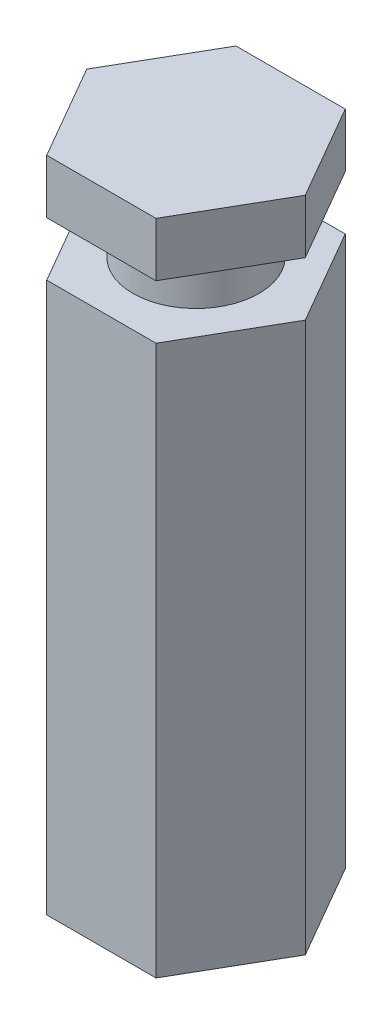
ISO-10303-21;
HEADER;
FILE_DESCRIPTION(('STEP AP214'),'2;1');
FILE_NAME('part.step','',(''),(''),'','','');
FILE_SCHEMA(('AUTOMOTIVE_DESIGN { 1 0 10303 214 1 1 1 1 }'));
ENDSEC;
DATA;
#1=APPLICATION_CONTEXT('core data for automotive mechanical design processes');
#2=APPLICATION_PROTOCOL_DEFINITION('international standard','automotive_design',2000,#1);
#3=PRODUCT_CONTEXT('',#1,'mechanical');
#4=PRODUCT('Part','Part','',(#3));
#5=PRODUCT_RELATED_PRODUCT_CATEGORY('part','',(#4));
#6=PRODUCT_DEFINITION_FORMATION('','',#4);
#7=PRODUCT_DEFINITION_CONTEXT('part definition',#1,'design');
#8=PRODUCT_DEFINITION('design','',#6,#7);
#9=PRODUCT_DEFINITION_SHAPE('','',#8);
#10=(LENGTH_UNIT() NAMED_UNIT(*) SI_UNIT(.MILLI.,.METRE.));
#11=(NAMED_UNIT(*) PLANE_ANGLE_UNIT() SI_UNIT($,.RADIAN.));
#12=(NAMED_UNIT(*) SI_UNIT($,.STERADIAN.) SOLID_ANGLE_UNIT());
#13=UNCERTAINTY_MEASURE_WITH_UNIT(LENGTH_MEASURE(1.E-05),#10,'distance_accuracy_value','');
#14=(GEOMETRIC_REPRESENTATION_CONTEXT(3) GLOBAL_UNCERTAINTY_ASSIGNED_CONTEXT((#13)) GLOBAL_UNIT_ASSIGNED_CONTEXT((#10,
#11,#12)) REPRESENTATION_CONTEXT('',''));
#15=CARTESIAN_POINT('',(0.,0.,0.));
#16=DIRECTION('',(0.,0.,1.));
#17=DIRECTION('',(1.,0.,0.));
#18=AXIS2_PLACEMENT_3D('',#15,#16,#17);
#19=CARTESIAN_POINT('',(-6.06217782649115,61.,-10.4999999999999));
#20=DIRECTION('',(0.866025403784441,0.,0.499999999999995));
#21=DIRECTION('',(0.499999999999995,0.,-0.866025403784442));
#22=AXIS2_PLACEMENT_3D('',#19,#20,#21);
#23=PLANE('',#22);
#24=DIRECTION('',(-0.499999999999995,0.,0.866025403784441));
#25=VECTOR('',#24,1.);
#26=CARTESIAN_POINT('',(-6.06217782649115,0.,-10.4999999999999));
#27=LINE('',#26,#25);
#28=CARTESIAN_POINT('',(-6.06217782649115,0.,-10.4999999999999));
#29=VERTEX_POINT('',#28);
#30=CARTESIAN_POINT('',(-12.1243556529821,0.,0.));
#31=VERTEX_POINT('',#30);
#32=EDGE_CURVE('E132',#29,#31,#27,.T.);
#33=ORIENTED_EDGE('',*,*,#32,.T.);
#34=DIRECTION('',(0.,-1.,0.));
#35=VECTOR('',#34,1.);
#36=CARTESIAN_POINT('',(-12.1243556529821,61.,0.));
#37=LINE('',#36,#35);
#38=CARTESIAN_POINT('',(-12.1243556529821,61.,0.));
#39=VERTEX_POINT('',#38);
#40=EDGE_CURVE('E42',#39,#31,#37,.T.);
#41=ORIENTED_EDGE('',*,*,#40,.F.);
#42=DIRECTION('',(-0.499999999999995,0.,0.866025403784441));
#43=VECTOR('',#42,1.);
#44=CARTESIAN_POINT('',(-6.06217782649115,61.,-10.4999999999999));
#45=LINE('',#44,#43);
#46=CARTESIAN_POINT('',(-6.06217782649115,61.,-10.4999999999999));
#47=VERTEX_POINT('',#46);
#48=EDGE_CURVE('E142',#47,#39,#45,.T.);
#49=ORIENTED_EDGE('',*,*,#48,.F.);
#50=DIRECTION('',(0.,-1.,0.));
#51=VECTOR('',#50,1.);
#52=CARTESIAN_POINT('',(-6.06217782649115,61.,-10.4999999999999));
#53=LINE('',#52,#51);
#54=EDGE_CURVE('E130',#47,#29,#53,.T.);
#55=ORIENTED_EDGE('',*,*,#54,.T.);
#56=EDGE_LOOP('',(#33,#41,#49,#55));
#57=FACE_BOUND('',#56,.T.);
#58=ADVANCED_FACE('F41',(#57),#23,.F.);
#59=CARTESIAN_POINT('',(-12.1243556529821,61.,0.));
#60=DIRECTION('',(0.866025403784438,0.,-0.500000000000001));
#61=DIRECTION('',(-0.500000000000001,0.,-0.866025403784438));
#62=AXIS2_PLACEMENT_3D('',#59,#60,#61);
#63=PLANE('',#62);
#64=DIRECTION('',(0.500000000000001,0.,0.866025403784438));
#65=VECTOR('',#64,1.);
#66=CARTESIAN_POINT('',(-12.1243556529821,0.,0.));
#67=LINE('',#66,#65);
#68=CARTESIAN_POINT('',(-6.06217782649101,0.,10.4999999999999));
#69=VERTEX_POINT('',#68);
#70=EDGE_CURVE('E131',#31,#69,#67,.T.);
#71=ORIENTED_EDGE('',*,*,#70,.T.);
#72=DIRECTION('',(0.,-1.,0.));
#73=VECTOR('',#72,1.);
#74=CARTESIAN_POINT('',(-6.06217782649101,61.,10.4999999999999));
#75=LINE('',#74,#73);
#76=CARTESIAN_POINT('',(-6.06217782649101,61.,10.4999999999999));
#77=VERTEX_POINT('',#76);
#78=EDGE_CURVE('E144',#77,#69,#75,.T.);
#79=ORIENTED_EDGE('',*,*,#78,.F.);
#80=DIRECTION('',(0.500000000000001,0.,0.866025403784438));
#81=VECTOR('',#80,1.);
#82=CARTESIAN_POINT('',(-12.1243556529821,61.,0.));
#83=LINE('',#82,#81);
#84=EDGE_CURVE('E100',#39,#77,#83,.T.);
#85=ORIENTED_EDGE('',*,*,#84,.F.);
#86=ORIENTED_EDGE('',*,*,#40,.T.);
#87=EDGE_LOOP('',(#71,#79,#85,#86));
#88=FACE_BOUND('',#87,.T.);
#89=ADVANCED_FACE('F147',(#88),#63,.F.);
#90=CARTESIAN_POINT('',(-6.06217782649101,61.,10.4999999999999));
#91=DIRECTION('',(0.,0.,-1.));
#92=DIRECTION('',(-1.,0.,0.));
#93=AXIS2_PLACEMENT_3D('',#90,#91,#92);
#94=PLANE('',#93);
#95=DIRECTION('',(1.,0.,0.));
#96=VECTOR('',#95,1.);
#97=CARTESIAN_POINT('',(-6.06217782649101,0.,10.4999999999999));
#98=LINE('',#97,#96);
#99=CARTESIAN_POINT('',(6.06217782649108,0.,10.4999999999999));
#100=VERTEX_POINT('',#99);
#101=EDGE_CURVE('E140',#69,#100,#98,.T.);
#102=ORIENTED_EDGE('',*,*,#101,.T.);
#103=DIRECTION('',(0.,-1.,0.));
#104=VECTOR('',#103,1.);
#105=CARTESIAN_POINT('',(6.06217782649108,61.,10.4999999999999));
#106=LINE('',#105,#104);
#107=CARTESIAN_POINT('',(6.06217782649108,61.,10.4999999999999));
#108=VERTEX_POINT('',#107);
#109=EDGE_CURVE('E125',#108,#100,#106,.T.);
#110=ORIENTED_EDGE('',*,*,#109,.F.);
#111=DIRECTION('',(1.,0.,0.));
#112=VECTOR('',#111,1.);
#113=CARTESIAN_POINT('',(-6.06217782649101,61.,10.4999999999999));
#114=LINE('',#113,#112);
#115=EDGE_CURVE('E114',#77,#108,#114,.T.);
#116=ORIENTED_EDGE('',*,*,#115,.F.);
#117=ORIENTED_EDGE('',*,*,#78,.T.);
#118=EDGE_LOOP('',(#102,#110,#116,#117));
#119=FACE_BOUND('',#118,.T.);
#120=ADVANCED_FACE('F156',(#119),#94,.F.);
#121=CARTESIAN_POINT('',(6.06217782649108,61.,10.4999999999999));
#122=DIRECTION('',(-0.866025403784441,0.,-0.499999999999995));
#123=DIRECTION('',(-0.499999999999995,0.,0.866025403784442));
#124=AXIS2_PLACEMENT_3D('',#121,#122,#123);
#125=PLANE('',#124);
#126=DIRECTION('',(0.499999999999995,0.,-0.866025403784442));
#127=VECTOR('',#126,1.);
#128=CARTESIAN_POINT('',(6.06217782649108,0.,10.4999999999999));
#129=LINE('',#128,#127);
#130=CARTESIAN_POINT('',(12.1243556529821,0.,0.));
#131=VERTEX_POINT('',#130);
#132=EDGE_CURVE('E122',#100,#131,#129,.T.);
#133=ORIENTED_EDGE('',*,*,#132,.T.);
#134=DIRECTION('',(0.,-1.,0.));
#135=VECTOR('',#134,1.);
#136=CARTESIAN_POINT('',(12.1243556529821,61.,0.));
#137=LINE('',#136,#135);
#138=CARTESIAN_POINT('',(12.1243556529821,61.,0.));
#139=VERTEX_POINT('',#138);
#140=EDGE_CURVE('E119',#139,#131,#137,.T.);
#141=ORIENTED_EDGE('',*,*,#140,.F.);
#142=DIRECTION('',(0.499999999999995,0.,-0.866025403784442));
#143=VECTOR('',#142,1.);
#144=CARTESIAN_POINT('',(6.06217782649108,61.,10.4999999999999));
#145=LINE('',#144,#143);
#146=EDGE_CURVE('E110',#108,#139,#145,.T.);
#147=ORIENTED_EDGE('',*,*,#146,.F.);
#148=ORIENTED_EDGE('',*,*,#109,.T.);
#149=EDGE_LOOP('',(#133,#141,#147,#148));
#150=FACE_BOUND('',#149,.T.);
#151=ADVANCED_FACE('F116',(#150),#125,.F.);
#152=CARTESIAN_POINT('',(12.1243556529821,61.,0.));
#153=DIRECTION('',(-0.866025403784434,0.,0.500000000000007));
#154=DIRECTION('',(0.500000000000007,0.,0.866025403784435));
#155=AXIS2_PLACEMENT_3D('',#152,#153,#154);
#156=PLANE('',#155);
#157=DIRECTION('',(-0.500000000000007,0.,-0.866025403784434));
#158=VECTOR('',#157,1.);
#159=CARTESIAN_POINT('',(12.1243556529821,0.,0.));
#160=LINE('',#159,#158);
#161=CARTESIAN_POINT('',(6.06217782649093,0.,-10.5));
#162=VERTEX_POINT('',#161);
#163=EDGE_CURVE('E85',#131,#162,#160,.T.);
#164=ORIENTED_EDGE('',*,*,#163,.T.);
#165=DIRECTION('',(0.,-1.,0.));
#166=VECTOR('',#165,1.);
#167=CARTESIAN_POINT('',(6.06217782649093,61.,-10.5));
#168=LINE('',#167,#166);
#169=CARTESIAN_POINT('',(6.06217782649093,61.,-10.5));
#170=VERTEX_POINT('',#169);
#171=EDGE_CURVE('E124',#170,#162,#168,.T.);
#172=ORIENTED_EDGE('',*,*,#171,.F.);
#173=DIRECTION('',(-0.500000000000007,0.,-0.866025403784434));
#174=VECTOR('',#173,1.);
#175=CARTESIAN_POINT('',(12.1243556529821,61.,0.));
#176=LINE('',#175,#174);
#177=EDGE_CURVE('E112',#139,#170,#176,.T.);
#178=ORIENTED_EDGE('',*,*,#177,.F.);
#179=ORIENTED_EDGE('',*,*,#140,.T.);
#180=EDGE_LOOP('',(#164,#172,#178,#179));
#181=FACE_BOUND('',#180,.T.);
#182=ADVANCED_FACE('F123',(#181),#156,.F.);
#183=CARTESIAN_POINT('',(6.06217782649093,61.,-10.5));
#184=DIRECTION('',(0.,0.,1.));
#185=DIRECTION('',(1.,0.,0.));
#186=AXIS2_PLACEMENT_3D('',#183,#184,#185);
#187=PLANE('',#186);
#188=DIRECTION('',(-1.,0.,0.));
#189=VECTOR('',#188,1.);
#190=CARTESIAN_POINT('',(6.06217782649093,0.,-10.5));
#191=LINE('',#190,#189);
#192=EDGE_CURVE('E86',#162,#29,#191,.T.);
#193=ORIENTED_EDGE('',*,*,#192,.T.);
#194=ORIENTED_EDGE('',*,*,#54,.F.);
#195=DIRECTION('',(-1.,0.,0.));
#196=VECTOR('',#195,1.);
#197=CARTESIAN_POINT('',(6.06217782649093,61.,-10.5));
#198=LINE('',#197,#196);
#199=EDGE_CURVE('E59',#170,#47,#198,.T.);
#200=ORIENTED_EDGE('',*,*,#199,.F.);
#201=ORIENTED_EDGE('',*,*,#171,.T.);
#202=EDGE_LOOP('',(#193,#194,#200,#201));
#203=FACE_BOUND('',#202,.T.);
#204=ADVANCED_FACE('F272',(#203),#187,.F.);
#205=CARTESIAN_POINT('',(0.,61.,0.));
#206=DIRECTION('',(0.,1.,0.));
#207=DIRECTION('',(0.,0.,1.));
#208=AXIS2_PLACEMENT_3D('',#205,#206,#207);
#209=PLANE('',#208);
#210=CARTESIAN_POINT('',(0.,61.,0.));
#211=DIRECTION('',(0.,1.,0.));
#212=DIRECTION('',(0.,0.,1.));
#213=AXIS2_PLACEMENT_3D('',#210,#211,#212);
#214=CIRCLE('',#213,7.);
#215=CARTESIAN_POINT('',(0.,61.,7.));
#216=VERTEX_POINT('',#215);
#217=EDGE_CURVE('E11',#216,#216,#214,.T.);
#218=ORIENTED_EDGE('',*,*,#217,.F.);
#219=EDGE_LOOP('',(#218));
#220=FACE_BOUND('',#219,.T.);
#221=ORIENTED_EDGE('',*,*,#48,.T.);
#222=ORIENTED_EDGE('',*,*,#84,.T.);
#223=ORIENTED_EDGE('',*,*,#115,.T.);
#224=ORIENTED_EDGE('',*,*,#146,.T.);
#225=ORIENTED_EDGE('',*,*,#177,.T.);
#226=ORIENTED_EDGE('',*,*,#199,.T.);
#227=EDGE_LOOP('',(#221,#222,#223,#224,#225,#226));
#228=FACE_BOUND('',#227,.T.);
#229=ADVANCED_FACE('F108',(#220,#228),#209,.T.);
#230=CARTESIAN_POINT('',(0.,0.,0.));
#231=DIRECTION('',(0.,1.,0.));
#232=DIRECTION('',(0.,0.,1.));
#233=AXIS2_PLACEMENT_3D('',#230,#231,#232);
#234=PLANE('',#233);
#235=ORIENTED_EDGE('',*,*,#32,.F.);
#236=ORIENTED_EDGE('',*,*,#192,.F.);
#237=ORIENTED_EDGE('',*,*,#163,.F.);
#238=ORIENTED_EDGE('',*,*,#132,.F.);
#239=ORIENTED_EDGE('',*,*,#101,.F.);
#240=ORIENTED_EDGE('',*,*,#70,.F.);
#241=EDGE_LOOP('',(#235,#236,#237,#238,#239,#240));
#242=FACE_BOUND('',#241,.T.);
#243=ADVANCED_FACE('F154',(#242),#234,.F.);
#244=CARTESIAN_POINT('',(0.,67.,0.));
#245=DIRECTION('',(0.,-1.,0.));
#246=DIRECTION('',(0.,0.,-1.));
#247=AXIS2_PLACEMENT_3D('',#244,#245,#246);
#248=CYLINDRICAL_SURFACE('',#247,7.);
#249=CARTESIAN_POINT('',(0.,67.,0.));
#250=DIRECTION('',(0.,1.,0.));
#251=DIRECTION('',(0.,0.,1.));
#252=AXIS2_PLACEMENT_3D('',#249,#250,#251);
#253=CIRCLE('',#252,7.);
#254=CARTESIAN_POINT('',(0.,67.,7.));
#255=VERTEX_POINT('',#254);
#256=EDGE_CURVE('E133',#255,#255,#253,.T.);
#257=ORIENTED_EDGE('',*,*,#256,.F.);
#258=EDGE_LOOP('',(#257));
#259=FACE_BOUND('',#258,.T.);
#260=ORIENTED_EDGE('',*,*,#217,.T.);
#261=EDGE_LOOP('',(#260));
#262=FACE_BOUND('',#261,.T.);
#263=ADVANCED_FACE('F279',(#259,#262),#248,.T.);
#264=CARTESIAN_POINT('',(-6.06217782649115,73.,-10.4999999999999));
#265=DIRECTION('',(0.866025403784441,0.,0.499999999999995));
#266=DIRECTION('',(0.499999999999995,0.,-0.866025403784441));
#267=AXIS2_PLACEMENT_3D('',#264,#265,#266);
#268=PLANE('',#267);
#269=DIRECTION('',(-0.499999999999995,0.,0.866025403784441));
#270=VECTOR('',#269,1.);
#271=CARTESIAN_POINT('',(-6.06217782649115,67.,-10.4999999999999));
#272=LINE('',#271,#270);
#273=CARTESIAN_POINT('',(-6.06217782649115,67.,-10.4999999999999));
#274=VERTEX_POINT('',#273);
#275=CARTESIAN_POINT('',(-12.1243556529821,67.,0.));
#276=VERTEX_POINT('',#275);
#277=EDGE_CURVE('E197',#274,#276,#272,.T.);
#278=ORIENTED_EDGE('',*,*,#277,.T.);
#279=DIRECTION('',(0.,-1.,0.));
#280=VECTOR('',#279,1.);
#281=CARTESIAN_POINT('',(-12.1243556529821,73.,0.));
#282=LINE('',#281,#280);
#283=CARTESIAN_POINT('',(-12.1243556529821,73.,0.));
#284=VERTEX_POINT('',#283);
#285=EDGE_CURVE('E165',#284,#276,#282,.T.);
#286=ORIENTED_EDGE('',*,*,#285,.F.);
#287=DIRECTION('',(-0.499999999999995,0.,0.866025403784441));
#288=VECTOR('',#287,1.);
#289=CARTESIAN_POINT('',(-6.06217782649115,73.,-10.4999999999999));
#290=LINE('',#289,#288);
#291=CARTESIAN_POINT('',(-6.06217782649115,73.,-10.4999999999999));
#292=VERTEX_POINT('',#291);
#293=EDGE_CURVE('E184',#292,#284,#290,.T.);
#294=ORIENTED_EDGE('',*,*,#293,.F.);
#295=DIRECTION('',(0.,-1.,0.));
#296=VECTOR('',#295,1.);
#297=CARTESIAN_POINT('',(-6.06217782649115,73.,-10.4999999999999));
#298=LINE('',#297,#296);
#299=EDGE_CURVE('E180',#292,#274,#298,.T.);
#300=ORIENTED_EDGE('',*,*,#299,.T.);
#301=EDGE_LOOP('',(#278,#286,#294,#300));
#302=FACE_BOUND('',#301,.T.);
#303=ADVANCED_FACE('F230',(#302),#268,.F.);
#304=CARTESIAN_POINT('',(-12.1243556529821,73.,0.));
#305=DIRECTION('',(0.866025403784438,0.,-0.500000000000001));
#306=DIRECTION('',(-0.500000000000001,0.,-0.866025403784438));
#307=AXIS2_PLACEMENT_3D('',#304,#305,#306);
#308=PLANE('',#307);
#309=DIRECTION('',(0.500000000000001,0.,0.866025403784438));
#310=VECTOR('',#309,1.);
#311=CARTESIAN_POINT('',(-12.1243556529821,67.,0.));
#312=LINE('',#311,#310);
#313=CARTESIAN_POINT('',(-6.06217782649101,67.,10.4999999999999));
#314=VERTEX_POINT('',#313);
#315=EDGE_CURVE('E191',#276,#314,#312,.T.);
#316=ORIENTED_EDGE('',*,*,#315,.T.);
#317=DIRECTION('',(0.,-1.,0.));
#318=VECTOR('',#317,1.);
#319=CARTESIAN_POINT('',(-6.06217782649101,73.,10.4999999999999));
#320=LINE('',#319,#318);
#321=CARTESIAN_POINT('',(-6.06217782649101,73.,10.4999999999999));
#322=VERTEX_POINT('',#321);
#323=EDGE_CURVE('E164',#322,#314,#320,.T.);
#324=ORIENTED_EDGE('',*,*,#323,.F.);
#325=DIRECTION('',(0.500000000000001,0.,0.866025403784438));
#326=VECTOR('',#325,1.);
#327=CARTESIAN_POINT('',(-12.1243556529821,73.,0.));
#328=LINE('',#327,#326);
#329=EDGE_CURVE('E211',#284,#322,#328,.T.);
#330=ORIENTED_EDGE('',*,*,#329,.F.);
#331=ORIENTED_EDGE('',*,*,#285,.T.);
#332=EDGE_LOOP('',(#316,#324,#330,#331));
#333=FACE_BOUND('',#332,.T.);
#334=ADVANCED_FACE('F232',(#333),#308,.F.);
#335=CARTESIAN_POINT('',(-6.06217782649101,73.,10.4999999999999));
#336=DIRECTION('',(0.,0.,-1.));
#337=DIRECTION('',(-1.,0.,0.));
#338=AXIS2_PLACEMENT_3D('',#335,#336,#337);
#339=PLANE('',#338);
#340=DIRECTION('',(1.,0.,0.));
#341=VECTOR('',#340,1.);
#342=CARTESIAN_POINT('',(-6.06217782649101,67.,10.4999999999999));
#343=LINE('',#342,#341);
#344=CARTESIAN_POINT('',(6.06217782649108,67.,10.4999999999999));
#345=VERTEX_POINT('',#344);
#346=EDGE_CURVE('E192',#314,#345,#343,.T.);
#347=ORIENTED_EDGE('',*,*,#346,.T.);
#348=DIRECTION('',(0.,-1.,0.));
#349=VECTOR('',#348,1.);
#350=CARTESIAN_POINT('',(6.06217782649108,73.,10.4999999999999));
#351=LINE('',#350,#349);
#352=CARTESIAN_POINT('',(6.06217782649108,73.,10.4999999999999));
#353=VERTEX_POINT('',#352);
#354=EDGE_CURVE('E169',#353,#345,#351,.T.);
#355=ORIENTED_EDGE('',*,*,#354,.F.);
#356=DIRECTION('',(1.,0.,0.));
#357=VECTOR('',#356,1.);
#358=CARTESIAN_POINT('',(-6.06217782649101,73.,10.4999999999999));
#359=LINE('',#358,#357);
#360=EDGE_CURVE('E208',#322,#353,#359,.T.);
#361=ORIENTED_EDGE('',*,*,#360,.F.);
#362=ORIENTED_EDGE('',*,*,#323,.T.);
#363=EDGE_LOOP('',(#347,#355,#361,#362));
#364=FACE_BOUND('',#363,.T.);
#365=ADVANCED_FACE('F286',(#364),#339,.F.);
#366=CARTESIAN_POINT('',(6.06217782649108,73.,10.4999999999999));
#367=DIRECTION('',(-0.866025403784441,0.,-0.499999999999995));
#368=DIRECTION('',(-0.499999999999995,0.,0.866025403784442));
#369=AXIS2_PLACEMENT_3D('',#366,#367,#368);
#370=PLANE('',#369);
#371=DIRECTION('',(0.499999999999995,0.,-0.866025403784442));
#372=VECTOR('',#371,1.);
#373=CARTESIAN_POINT('',(6.06217782649108,67.,10.4999999999999));
#374=LINE('',#373,#372);
#375=CARTESIAN_POINT('',(12.1243556529821,67.,0.));
#376=VERTEX_POINT('',#375);
#377=EDGE_CURVE('E189',#345,#376,#374,.T.);
#378=ORIENTED_EDGE('',*,*,#377,.T.);
#379=DIRECTION('',(0.,-1.,0.));
#380=VECTOR('',#379,1.);
#381=CARTESIAN_POINT('',(12.1243556529821,73.,0.));
#382=LINE('',#381,#380);
#383=CARTESIAN_POINT('',(12.1243556529821,73.,0.));
#384=VERTEX_POINT('',#383);
#385=EDGE_CURVE('E172',#384,#376,#382,.T.);
#386=ORIENTED_EDGE('',*,*,#385,.F.);
#387=DIRECTION('',(0.499999999999995,0.,-0.866025403784442));
#388=VECTOR('',#387,1.);
#389=CARTESIAN_POINT('',(6.06217782649108,73.,10.4999999999999));
#390=LINE('',#389,#388);
#391=EDGE_CURVE('E202',#353,#384,#390,.T.);
#392=ORIENTED_EDGE('',*,*,#391,.F.);
#393=ORIENTED_EDGE('',*,*,#354,.T.);
#394=EDGE_LOOP('',(#378,#386,#392,#393));
#395=FACE_BOUND('',#394,.T.);
#396=ADVANCED_FACE('F295',(#395),#370,.F.);
#397=CARTESIAN_POINT('',(12.1243556529821,73.,0.));
#398=DIRECTION('',(-0.866025403784435,0.,0.500000000000007));
#399=DIRECTION('',(0.500000000000007,0.,0.866025403784434));
#400=AXIS2_PLACEMENT_3D('',#397,#398,#399);
#401=PLANE('',#400);
#402=DIRECTION('',(-0.500000000000007,0.,-0.866025403784434));
#403=VECTOR('',#402,1.);
#404=CARTESIAN_POINT('',(12.1243556529821,67.,0.));
#405=LINE('',#404,#403);
#406=CARTESIAN_POINT('',(6.06217782649093,67.,-10.5));
#407=VERTEX_POINT('',#406);
#408=EDGE_CURVE('E183',#376,#407,#405,.T.);
#409=ORIENTED_EDGE('',*,*,#408,.T.);
#410=DIRECTION('',(0.,-1.,0.));
#411=VECTOR('',#410,1.);
#412=CARTESIAN_POINT('',(6.06217782649093,73.,-10.5));
#413=LINE('',#412,#411);
#414=CARTESIAN_POINT('',(6.06217782649093,73.,-10.5));
#415=VERTEX_POINT('',#414);
#416=EDGE_CURVE('E171',#415,#407,#413,.T.);
#417=ORIENTED_EDGE('',*,*,#416,.F.);
#418=DIRECTION('',(-0.500000000000007,0.,-0.866025403784434));
#419=VECTOR('',#418,1.);
#420=CARTESIAN_POINT('',(12.1243556529821,73.,0.));
#421=LINE('',#420,#419);
#422=EDGE_CURVE('E205',#384,#415,#421,.T.);
#423=ORIENTED_EDGE('',*,*,#422,.F.);
#424=ORIENTED_EDGE('',*,*,#385,.T.);
#425=EDGE_LOOP('',(#409,#417,#423,#424));
#426=FACE_BOUND('',#425,.T.);
#427=ADVANCED_FACE('F297',(#426),#401,.F.);
#428=CARTESIAN_POINT('',(6.06217782649093,73.,-10.5));
#429=DIRECTION('',(0.,0.,1.));
#430=DIRECTION('',(1.,0.,0.));
#431=AXIS2_PLACEMENT_3D('',#428,#429,#430);
#432=PLANE('',#431);
#433=DIRECTION('',(-1.,0.,0.));
#434=VECTOR('',#433,1.);
#435=CARTESIAN_POINT('',(6.06217782649093,67.,-10.5));
#436=LINE('',#435,#434);
#437=EDGE_CURVE('E182',#407,#274,#436,.T.);
#438=ORIENTED_EDGE('',*,*,#437,.T.);
#439=ORIENTED_EDGE('',*,*,#299,.F.);
#440=DIRECTION('',(-1.,0.,0.));
#441=VECTOR('',#440,1.);
#442=CARTESIAN_POINT('',(6.06217782649093,73.,-10.5));
#443=LINE('',#442,#441);
#444=EDGE_CURVE('E178',#415,#292,#443,.T.);
#445=ORIENTED_EDGE('',*,*,#444,.F.);
#446=ORIENTED_EDGE('',*,*,#416,.T.);
#447=EDGE_LOOP('',(#438,#439,#445,#446));
#448=FACE_BOUND('',#447,.T.);
#449=ADVANCED_FACE('F248',(#448),#432,.F.);
#450=CARTESIAN_POINT('',(0.,73.,0.));
#451=DIRECTION('',(0.,1.,0.));
#452=DIRECTION('',(0.,0.,1.));
#453=AXIS2_PLACEMENT_3D('',#450,#451,#452);
#454=PLANE('',#453);
#455=ORIENTED_EDGE('',*,*,#293,.T.);
#456=ORIENTED_EDGE('',*,*,#329,.T.);
#457=ORIENTED_EDGE('',*,*,#360,.T.);
#458=ORIENTED_EDGE('',*,*,#391,.T.);
#459=ORIENTED_EDGE('',*,*,#422,.T.);
#460=ORIENTED_EDGE('',*,*,#444,.T.);
#461=EDGE_LOOP('',(#455,#456,#457,#458,#459,#460));
#462=FACE_BOUND('',#461,.T.);
#463=ADVANCED_FACE('F218',(#462),#454,.T.);
#464=CARTESIAN_POINT('',(0.,67.,0.));
#465=DIRECTION('',(0.,1.,0.));
#466=DIRECTION('',(0.,0.,1.));
#467=AXIS2_PLACEMENT_3D('',#464,#465,#466);
#468=PLANE('',#467);
#469=ORIENTED_EDGE('',*,*,#256,.T.);
#470=EDGE_LOOP('',(#469));
#471=FACE_BOUND('',#470,.T.);
#472=ORIENTED_EDGE('',*,*,#277,.F.);
#473=ORIENTED_EDGE('',*,*,#437,.F.);
#474=ORIENTED_EDGE('',*,*,#408,.F.);
#475=ORIENTED_EDGE('',*,*,#377,.F.);
#476=ORIENTED_EDGE('',*,*,#346,.F.);
#477=ORIENTED_EDGE('',*,*,#315,.F.);
#478=EDGE_LOOP('',(#472,#473,#474,#475,#476,#477));
#479=FACE_BOUND('',#478,.T.);
#480=ADVANCED_FACE('F253',(#471,#479),#468,.F.);
#481=CLOSED_SHELL('',(#58,#89,#120,#151,#182,#204,#229,#243,#263,#303,#334,#365,#396,#427,#449,
#463,#480));
#482=MANIFOLD_SOLID_BREP('B2',#481);
#483=ADVANCED_BREP_SHAPE_REPRESENTATION('',(#18,#482),#14);
#484=SHAPE_DEFINITION_REPRESENTATION(#9,#483);
ENDSEC;
END-ISO-10303-21;
